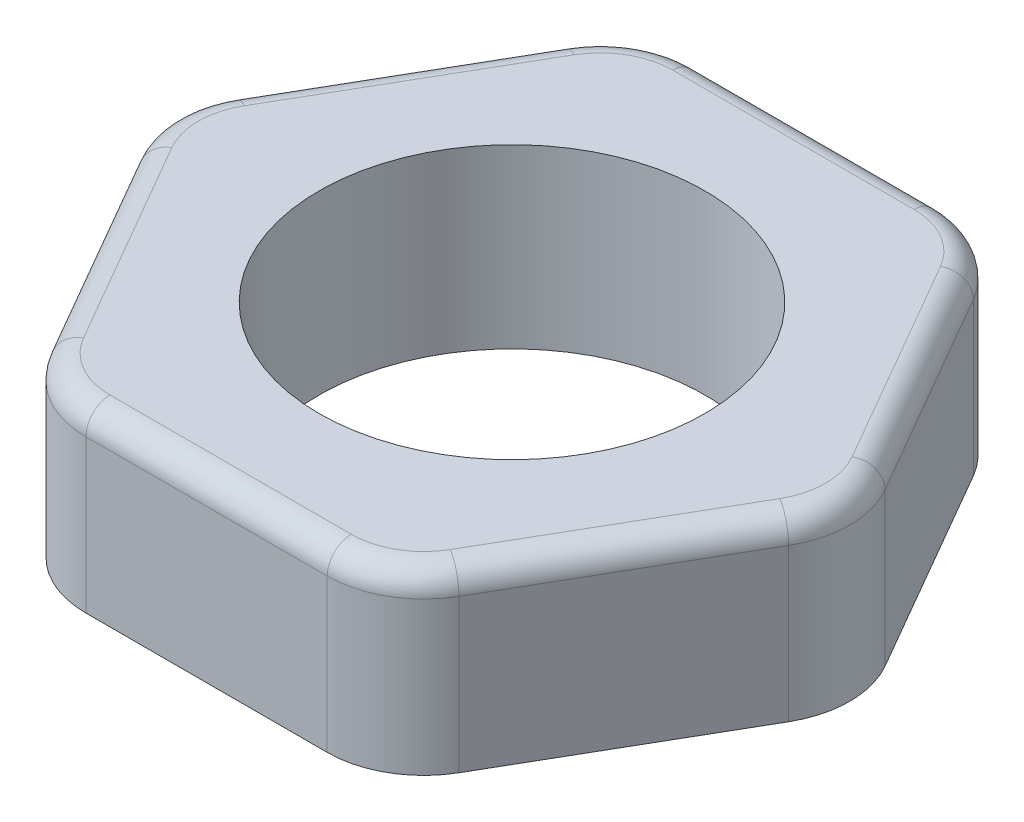
ISO-10303-21;
HEADER;
FILE_DESCRIPTION(('STEP AP214'),'2;1');
FILE_NAME('part.step','',(''),(''),'','','');
FILE_SCHEMA(('AUTOMOTIVE_DESIGN { 1 0 10303 214 1 1 1 1 }'));
ENDSEC;
DATA;
#1=APPLICATION_CONTEXT('core data for automotive mechanical design processes');
#2=APPLICATION_PROTOCOL_DEFINITION('international standard','automotive_design',2000,#1);
#3=PRODUCT_CONTEXT('',#1,'mechanical');
#4=PRODUCT('Part','Part','',(#3));
#5=PRODUCT_RELATED_PRODUCT_CATEGORY('part','',(#4));
#6=PRODUCT_DEFINITION_FORMATION('','',#4);
#7=PRODUCT_DEFINITION_CONTEXT('part definition',#1,'design');
#8=PRODUCT_DEFINITION('design','',#6,#7);
#9=PRODUCT_DEFINITION_SHAPE('','',#8);
#10=(LENGTH_UNIT() NAMED_UNIT(*) SI_UNIT(.MILLI.,.METRE.));
#11=(NAMED_UNIT(*) PLANE_ANGLE_UNIT() SI_UNIT($,.RADIAN.));
#12=(NAMED_UNIT(*) SI_UNIT($,.STERADIAN.) SOLID_ANGLE_UNIT());
#13=UNCERTAINTY_MEASURE_WITH_UNIT(LENGTH_MEASURE(1.E-05),#10,'distance_accuracy_value','');
#14=(GEOMETRIC_REPRESENTATION_CONTEXT(3) GLOBAL_UNCERTAINTY_ASSIGNED_CONTEXT((#13)) GLOBAL_UNIT_ASSIGNED_CONTEXT((#10,
#11,#12)) REPRESENTATION_CONTEXT('',''));
#15=CARTESIAN_POINT('',(0.,0.,0.));
#16=DIRECTION('',(0.,0.,1.));
#17=DIRECTION('',(1.,0.,0.));
#18=AXIS2_PLACEMENT_3D('',#15,#16,#17);
#19=CARTESIAN_POINT('',(0.,5.5,0.));
#20=DIRECTION('',(0.,1.,0.));
#21=DIRECTION('',(0.,0.,1.));
#22=AXIS2_PLACEMENT_3D('',#19,#20,#21);
#23=PLANE('',#22);
#24=CARTESIAN_POINT('',(0.,5.5,0.));
#25=DIRECTION('',(0.,1.,0.));
#26=DIRECTION('',(0.,0.,1.));
#27=AXIS2_PLACEMENT_3D('',#24,#25,#26);
#28=CIRCLE('',#27,6.);
#29=CARTESIAN_POINT('',(0.,5.5,6.));
#30=VERTEX_POINT('',#29);
#31=EDGE_CURVE('E291',#30,#30,#28,.T.);
#32=ORIENTED_EDGE('',*,*,#31,.F.);
#33=EDGE_LOOP('',(#32));
#34=FACE_BOUND('',#33,.T.);
#35=CARTESIAN_POINT('',(3.75277674973264,5.5,6.49999999999992));
#36=DIRECTION('',(0.,1.,0.));
#37=DIRECTION('',(0.,0.,1.));
#38=AXIS2_PLACEMENT_3D('',#35,#36,#37);
#39=CIRCLE('',#38,2.25);
#40=CARTESIAN_POINT('',(5.70133390824763,5.5,7.62499999999991));
#41=VERTEX_POINT('',#40);
#42=CARTESIAN_POINT('',(3.75277674973266,5.5,8.74999999999992));
#43=VERTEX_POINT('',#42);
#44=EDGE_CURVE('E372',#41,#43,#39,.F.);
#45=ORIENTED_EDGE('',*,*,#44,.F.);
#46=DIRECTION('',(0.499999999999995,0.,-0.866025403784442));
#47=VECTOR('',#46,1.);
#48=CARTESIAN_POINT('',(10.3201360617645,5.5,-0.374999999999997));
#49=LINE('',#48,#47);
#50=CARTESIAN_POINT('',(9.4541106579801,5.5,1.125));
#51=VERTEX_POINT('',#50);
#52=EDGE_CURVE('E325',#41,#51,#49,.T.);
#53=ORIENTED_EDGE('',*,*,#52,.T.);
#54=CARTESIAN_POINT('',(7.5055534994651,5.5,0.));
#55=DIRECTION('',(0.,1.,0.));
#56=DIRECTION('',(0.,0.,1.));
#57=AXIS2_PLACEMENT_3D('',#54,#55,#56);
#58=CIRCLE('',#57,2.25);
#59=CARTESIAN_POINT('',(9.45411065798009,5.5,-1.12499999999999));
#60=VERTEX_POINT('',#59);
#61=EDGE_CURVE('E368',#60,#51,#58,.F.);
#62=ORIENTED_EDGE('',*,*,#61,.F.);
#63=DIRECTION('',(-0.500000000000001,0.,-0.866025403784438));
#64=VECTOR('',#63,1.);
#65=CARTESIAN_POINT('',(4.83530850446308,5.5,-9.12499999999998));
#66=LINE('',#65,#64);
#67=CARTESIAN_POINT('',(5.70133390824752,5.5,-7.62499999999998));
#68=VERTEX_POINT('',#67);
#69=EDGE_CURVE('E329',#60,#68,#66,.T.);
#70=ORIENTED_EDGE('',*,*,#69,.T.);
#71=CARTESIAN_POINT('',(3.75277674973253,5.5,-6.49999999999998));
#72=DIRECTION('',(0.,1.,0.));
#73=DIRECTION('',(0.,0.,1.));
#74=AXIS2_PLACEMENT_3D('',#71,#72,#73);
#75=CIRCLE('',#74,2.25);
#76=CARTESIAN_POINT('',(3.75277674973253,5.5,-8.74999999999998));
#77=VERTEX_POINT('',#76);
#78=EDGE_CURVE('E181',#77,#68,#75,.F.);
#79=ORIENTED_EDGE('',*,*,#78,.F.);
#80=DIRECTION('',(-1.,0.,0.));
#81=VECTOR('',#80,1.);
#82=CARTESIAN_POINT('',(-5.48482755730147,5.5,-8.74999999999994));
#83=LINE('',#82,#81);
#84=CARTESIAN_POINT('',(-3.75277674973259,5.5,-8.74999999999995));
#85=VERTEX_POINT('',#84);
#86=EDGE_CURVE('E175',#77,#85,#83,.T.);
#87=ORIENTED_EDGE('',*,*,#86,.T.);
#88=CARTESIAN_POINT('',(-3.75277674973258,5.5,-6.49999999999995));
#89=DIRECTION('',(0.,1.,0.));
#90=DIRECTION('',(0.,0.,1.));
#91=AXIS2_PLACEMENT_3D('',#88,#89,#90);
#92=CIRCLE('',#91,2.25);
#93=CARTESIAN_POINT('',(-5.70133390824757,5.5,-7.62499999999994));
#94=VERTEX_POINT('',#93);
#95=EDGE_CURVE('E170',#94,#85,#92,.F.);
#96=ORIENTED_EDGE('',*,*,#95,.F.);
#97=DIRECTION('',(-0.499999999999995,0.,0.866025403784442));
#98=VECTOR('',#97,1.);
#99=CARTESIAN_POINT('',(-10.3201360617645,5.5,0.375000000000073));
#100=LINE('',#99,#98);
#101=CARTESIAN_POINT('',(-9.45411065798009,5.5,-1.12499999999994));
#102=VERTEX_POINT('',#101);
#103=EDGE_CURVE('E173',#94,#102,#100,.T.);
#104=ORIENTED_EDGE('',*,*,#103,.T.);
#105=CARTESIAN_POINT('',(-7.50555349946509,5.5,0.));
#106=DIRECTION('',(0.,1.,0.));
#107=DIRECTION('',(0.,0.,1.));
#108=AXIS2_PLACEMENT_3D('',#105,#106,#107);
#109=CIRCLE('',#108,2.25);
#110=CARTESIAN_POINT('',(-9.45411065798007,5.5,1.12500000000007));
#111=VERTEX_POINT('',#110);
#112=EDGE_CURVE('E182',#111,#102,#109,.F.);
#113=ORIENTED_EDGE('',*,*,#112,.F.);
#114=DIRECTION('',(0.500000000000007,0.,0.866025403784435));
#115=VECTOR('',#114,1.);
#116=CARTESIAN_POINT('',(-4.83530850446301,5.5,9.12500000000001));
#117=LINE('',#116,#115);
#118=CARTESIAN_POINT('',(-5.70133390824747,5.5,7.62500000000002));
#119=VERTEX_POINT('',#118);
#120=EDGE_CURVE('E193',#111,#119,#117,.T.);
#121=ORIENTED_EDGE('',*,*,#120,.T.);
#122=CARTESIAN_POINT('',(-3.75277674973249,5.5,6.5));
#123=DIRECTION('',(0.,1.,0.));
#124=DIRECTION('',(0.,0.,1.));
#125=AXIS2_PLACEMENT_3D('',#122,#123,#124);
#126=CIRCLE('',#125,2.25);
#127=CARTESIAN_POINT('',(-3.75277674973247,5.5,8.75));
#128=VERTEX_POINT('',#127);
#129=EDGE_CURVE('E360',#128,#119,#126,.F.);
#130=ORIENTED_EDGE('',*,*,#129,.F.);
#131=DIRECTION('',(1.,0.,0.));
#132=VECTOR('',#131,1.);
#133=CARTESIAN_POINT('',(5.48482755730153,5.5,8.7499999999999));
#134=LINE('',#133,#132);
#135=EDGE_CURVE('E321',#128,#43,#134,.T.);
#136=ORIENTED_EDGE('',*,*,#135,.T.);
#137=EDGE_LOOP('',(#45,#53,#62,#70,#79,#87,#96,#104,#113,#121,#130,#136));
#138=FACE_BOUND('',#137,.T.);
#139=ADVANCED_FACE('F41',(#34,#138),#23,.T.);
#140=CARTESIAN_POINT('',(5.48482755730154,5.5,9.4999999999999));
#141=DIRECTION('',(-0.866025403784442,0.,-0.499999999999995));
#142=DIRECTION('',(-0.499999999999995,0.,0.866025403784442));
#143=AXIS2_PLACEMENT_3D('',#140,#141,#142);
#144=PLANE('',#143);
#145=DIRECTION('',(0.499999999999995,0.,-0.866025403784441));
#146=VECTOR('',#145,1.);
#147=CARTESIAN_POINT('',(5.48482755730154,0.,9.4999999999999));
#148=LINE('',#147,#146);
#149=CARTESIAN_POINT('',(6.35085296108596,0.,7.99999999999991));
#150=VERTEX_POINT('',#149);
#151=CARTESIAN_POINT('',(10.1036297108184,0.,1.5));
#152=VERTEX_POINT('',#151);
#153=EDGE_CURVE('E267',#150,#152,#148,.T.);
#154=ORIENTED_EDGE('',*,*,#153,.T.);
#155=DIRECTION('',(0.,-1.,0.));
#156=VECTOR('',#155,1.);
#157=CARTESIAN_POINT('',(10.1036297108184,5.5,1.5));
#158=LINE('',#157,#156);
#159=CARTESIAN_POINT('',(10.1036297108184,4.75,1.5));
#160=VERTEX_POINT('',#159);
#161=EDGE_CURVE('E11',#152,#160,#158,.F.);
#162=ORIENTED_EDGE('',*,*,#161,.T.);
#163=DIRECTION('',(0.499999999999995,0.,-0.866025403784442));
#164=VECTOR('',#163,1.);
#165=CARTESIAN_POINT('',(5.48482755730154,4.75,9.4999999999999));
#166=LINE('',#165,#164);
#167=CARTESIAN_POINT('',(6.35085296108596,4.75,7.99999999999991));
#168=VERTEX_POINT('',#167);
#169=EDGE_CURVE('E352',#160,#168,#166,.F.);
#170=ORIENTED_EDGE('',*,*,#169,.T.);
#171=DIRECTION('',(0.,-1.,0.));
#172=VECTOR('',#171,1.);
#173=CARTESIAN_POINT('',(6.35085296108596,5.5,7.99999999999991));
#174=LINE('',#173,#172);
#175=EDGE_CURVE('E51',#168,#150,#174,.T.);
#176=ORIENTED_EDGE('',*,*,#175,.T.);
#177=EDGE_LOOP('',(#154,#162,#170,#176));
#178=FACE_BOUND('',#177,.T.);
#179=ADVANCED_FACE('F430',(#178),#144,.F.);
#180=CARTESIAN_POINT('',(10.9696551146029,5.5,0.));
#181=DIRECTION('',(-0.866025403784438,0.,0.500000000000001));
#182=DIRECTION('',(0.500000000000001,0.,0.866025403784438));
#183=AXIS2_PLACEMENT_3D('',#180,#181,#182);
#184=PLANE('',#183);
#185=DIRECTION('',(-0.500000000000001,0.,-0.866025403784438));
#186=VECTOR('',#185,1.);
#187=CARTESIAN_POINT('',(10.9696551146029,0.,0.));
#188=LINE('',#187,#186);
#189=CARTESIAN_POINT('',(10.1036297108184,0.,-1.49999999999999));
#190=VERTEX_POINT('',#189);
#191=CARTESIAN_POINT('',(6.35085296108585,0.,-7.99999999999998));
#192=VERTEX_POINT('',#191);
#193=EDGE_CURVE('E302',#190,#192,#188,.T.);
#194=ORIENTED_EDGE('',*,*,#193,.T.);
#195=DIRECTION('',(0.,-1.,0.));
#196=VECTOR('',#195,1.);
#197=CARTESIAN_POINT('',(6.35085296108585,5.5,-7.99999999999998));
#198=LINE('',#197,#196);
#199=CARTESIAN_POINT('',(6.35085296108585,4.75,-7.99999999999998));
#200=VERTEX_POINT('',#199);
#201=EDGE_CURVE('E258',#192,#200,#198,.F.);
#202=ORIENTED_EDGE('',*,*,#201,.T.);
#203=DIRECTION('',(-0.500000000000001,0.,-0.866025403784438));
#204=VECTOR('',#203,1.);
#205=CARTESIAN_POINT('',(10.9696551146029,4.75,0.));
#206=LINE('',#205,#204);
#207=CARTESIAN_POINT('',(10.1036297108184,4.75,-1.49999999999999));
#208=VERTEX_POINT('',#207);
#209=EDGE_CURVE('E349',#200,#208,#206,.F.);
#210=ORIENTED_EDGE('',*,*,#209,.T.);
#211=DIRECTION('',(0.,-1.,0.));
#212=VECTOR('',#211,1.);
#213=CARTESIAN_POINT('',(10.1036297108184,5.5,-1.49999999999999));
#214=LINE('',#213,#212);
#215=EDGE_CURVE('E66',#208,#190,#214,.T.);
#216=ORIENTED_EDGE('',*,*,#215,.T.);
#217=EDGE_LOOP('',(#194,#202,#210,#216));
#218=FACE_BOUND('',#217,.T.);
#219=ADVANCED_FACE('F420',(#218),#184,.F.);
#220=CARTESIAN_POINT('',(5.48482755730141,5.5,-9.49999999999998));
#221=DIRECTION('',(0.,0.,1.));
#222=DIRECTION('',(1.,0.,0.));
#223=AXIS2_PLACEMENT_3D('',#220,#221,#222);
#224=PLANE('',#223);
#225=DIRECTION('',(-1.,0.,0.));
#226=VECTOR('',#225,1.);
#227=CARTESIAN_POINT('',(5.48482755730141,0.,-9.49999999999998));
#228=LINE('',#227,#226);
#229=CARTESIAN_POINT('',(3.75277674973252,0.,-9.49999999999998));
#230=VERTEX_POINT('',#229);
#231=CARTESIAN_POINT('',(-3.75277674973259,0.,-9.49999999999995));
#232=VERTEX_POINT('',#231);
#233=EDGE_CURVE('E305',#230,#232,#228,.T.);
#234=ORIENTED_EDGE('',*,*,#233,.T.);
#235=DIRECTION('',(0.,-1.,0.));
#236=VECTOR('',#235,1.);
#237=CARTESIAN_POINT('',(-3.75277674973259,5.5,-9.49999999999995));
#238=LINE('',#237,#236);
#239=CARTESIAN_POINT('',(-3.75277674973259,4.75,-9.49999999999995));
#240=VERTEX_POINT('',#239);
#241=EDGE_CURVE('E253',#232,#240,#238,.F.);
#242=ORIENTED_EDGE('',*,*,#241,.T.);
#243=DIRECTION('',(-1.,0.,0.));
#244=VECTOR('',#243,1.);
#245=CARTESIAN_POINT('',(5.48482755730141,4.75,-9.49999999999998));
#246=LINE('',#245,#244);
#247=CARTESIAN_POINT('',(3.75277674973252,4.75,-9.49999999999998));
#248=VERTEX_POINT('',#247);
#249=EDGE_CURVE('E345',#240,#248,#246,.F.);
#250=ORIENTED_EDGE('',*,*,#249,.T.);
#251=DIRECTION('',(0.,-1.,0.));
#252=VECTOR('',#251,1.);
#253=CARTESIAN_POINT('',(3.75277674973252,5.5,-9.49999999999998));
#254=LINE('',#253,#252);
#255=EDGE_CURVE('E250',#248,#230,#254,.T.);
#256=ORIENTED_EDGE('',*,*,#255,.T.);
#257=EDGE_LOOP('',(#234,#242,#250,#256));
#258=FACE_BOUND('',#257,.T.);
#259=ADVANCED_FACE('F402',(#258),#224,.F.);
#260=CARTESIAN_POINT('',(-5.48482755730147,5.5,-9.49999999999994));
#261=DIRECTION('',(0.866025403784442,0.,0.499999999999995));
#262=DIRECTION('',(0.499999999999995,0.,-0.866025403784442));
#263=AXIS2_PLACEMENT_3D('',#260,#261,#262);
#264=PLANE('',#263);
#265=DIRECTION('',(-0.499999999999995,0.,0.866025403784442));
#266=VECTOR('',#265,1.);
#267=CARTESIAN_POINT('',(-5.48482755730147,0.,-9.49999999999994));
#268=LINE('',#267,#266);
#269=CARTESIAN_POINT('',(-6.3508529610859,0.,-7.99999999999993));
#270=VERTEX_POINT('',#269);
#271=CARTESIAN_POINT('',(-10.1036297108184,0.,-1.49999999999993));
#272=VERTEX_POINT('',#271);
#273=EDGE_CURVE('E309',#270,#272,#268,.T.);
#274=ORIENTED_EDGE('',*,*,#273,.T.);
#275=DIRECTION('',(0.,-1.,0.));
#276=VECTOR('',#275,1.);
#277=CARTESIAN_POINT('',(-10.1036297108184,5.5,-1.49999999999993));
#278=LINE('',#277,#276);
#279=CARTESIAN_POINT('',(-10.1036297108184,4.75,-1.49999999999993));
#280=VERTEX_POINT('',#279);
#281=EDGE_CURVE('E247',#272,#280,#278,.F.);
#282=ORIENTED_EDGE('',*,*,#281,.T.);
#283=DIRECTION('',(-0.499999999999995,0.,0.866025403784442));
#284=VECTOR('',#283,1.);
#285=CARTESIAN_POINT('',(-5.48482755730147,4.75,-9.49999999999994));
#286=LINE('',#285,#284);
#287=CARTESIAN_POINT('',(-6.3508529610859,4.75,-7.99999999999993));
#288=VERTEX_POINT('',#287);
#289=EDGE_CURVE('E342',#280,#288,#286,.F.);
#290=ORIENTED_EDGE('',*,*,#289,.T.);
#291=DIRECTION('',(0.,-1.,0.));
#292=VECTOR('',#291,1.);
#293=CARTESIAN_POINT('',(-6.3508529610859,5.5,-7.99999999999993));
#294=LINE('',#293,#292);
#295=EDGE_CURVE('E244',#288,#270,#294,.T.);
#296=ORIENTED_EDGE('',*,*,#295,.T.);
#297=EDGE_LOOP('',(#274,#282,#290,#296));
#298=FACE_BOUND('',#297,.T.);
#299=ADVANCED_FACE('F465',(#298),#264,.F.);
#300=CARTESIAN_POINT('',(-10.9696551146029,5.5,0.));
#301=DIRECTION('',(0.866025403784435,0.,-0.500000000000007));
#302=DIRECTION('',(-0.500000000000007,0.,-0.866025403784435));
#303=AXIS2_PLACEMENT_3D('',#300,#301,#302);
#304=PLANE('',#303);
#305=DIRECTION('',(0.500000000000007,0.,0.866025403784435));
#306=VECTOR('',#305,1.);
#307=CARTESIAN_POINT('',(-10.9696551146029,0.,0.));
#308=LINE('',#307,#306);
#309=CARTESIAN_POINT('',(-10.1036297108184,0.,1.50000000000007));
#310=VERTEX_POINT('',#309);
#311=CARTESIAN_POINT('',(-6.35085296108579,0.,8.00000000000002));
#312=VERTEX_POINT('',#311);
#313=EDGE_CURVE('E313',#310,#312,#308,.T.);
#314=ORIENTED_EDGE('',*,*,#313,.T.);
#315=DIRECTION('',(0.,-1.,0.));
#316=VECTOR('',#315,1.);
#317=CARTESIAN_POINT('',(-6.35085296108579,5.5,8.00000000000002));
#318=LINE('',#317,#316);
#319=CARTESIAN_POINT('',(-6.35085296108579,4.75,8.00000000000002));
#320=VERTEX_POINT('',#319);
#321=EDGE_CURVE('E241',#312,#320,#318,.F.);
#322=ORIENTED_EDGE('',*,*,#321,.T.);
#323=DIRECTION('',(0.500000000000007,0.,0.866025403784435));
#324=VECTOR('',#323,1.);
#325=CARTESIAN_POINT('',(-10.9696551146029,4.75,0.));
#326=LINE('',#325,#324);
#327=CARTESIAN_POINT('',(-10.1036297108184,4.75,1.50000000000007));
#328=VERTEX_POINT('',#327);
#329=EDGE_CURVE('E338',#320,#328,#326,.F.);
#330=ORIENTED_EDGE('',*,*,#329,.T.);
#331=DIRECTION('',(0.,-1.,0.));
#332=VECTOR('',#331,1.);
#333=CARTESIAN_POINT('',(-10.1036297108184,5.5,1.50000000000007));
#334=LINE('',#333,#332);
#335=EDGE_CURVE('E238',#328,#310,#334,.T.);
#336=ORIENTED_EDGE('',*,*,#335,.T.);
#337=EDGE_LOOP('',(#314,#322,#330,#336));
#338=FACE_BOUND('',#337,.T.);
#339=ADVANCED_FACE('F456',(#338),#304,.F.);
#340=CARTESIAN_POINT('',(-5.48482755730134,5.5,9.50000000000002));
#341=DIRECTION('',(0.,0.,-1.));
#342=DIRECTION('',(-1.,0.,0.));
#343=AXIS2_PLACEMENT_3D('',#340,#341,#342);
#344=PLANE('',#343);
#345=DIRECTION('',(1.,0.,0.));
#346=VECTOR('',#345,1.);
#347=CARTESIAN_POINT('',(-5.48482755730134,4.75,9.50000000000002));
#348=LINE('',#347,#346);
#349=CARTESIAN_POINT('',(3.75277674973267,4.75,9.49999999999992));
#350=VERTEX_POINT('',#349);
#351=CARTESIAN_POINT('',(-3.75277674973246,4.75,9.5));
#352=VERTEX_POINT('',#351);
#353=EDGE_CURVE('E356',#350,#352,#348,.F.);
#354=ORIENTED_EDGE('',*,*,#353,.T.);
#355=DIRECTION('',(0.,-1.,0.));
#356=VECTOR('',#355,1.);
#357=CARTESIAN_POINT('',(-3.75277674973246,5.5,9.5));
#358=LINE('',#357,#356);
#359=CARTESIAN_POINT('',(-3.75277674973246,0.,9.5));
#360=VERTEX_POINT('',#359);
#361=EDGE_CURVE('E218',#352,#360,#358,.T.);
#362=ORIENTED_EDGE('',*,*,#361,.T.);
#363=DIRECTION('',(1.,0.,0.));
#364=VECTOR('',#363,1.);
#365=CARTESIAN_POINT('',(-5.48482755730134,0.,9.50000000000002));
#366=LINE('',#365,#364);
#367=CARTESIAN_POINT('',(3.75277674973267,0.,9.49999999999992));
#368=VERTEX_POINT('',#367);
#369=EDGE_CURVE('E317',#360,#368,#366,.T.);
#370=ORIENTED_EDGE('',*,*,#369,.T.);
#371=DIRECTION('',(0.,-1.,0.));
#372=VECTOR('',#371,1.);
#373=CARTESIAN_POINT('',(3.75277674973267,5.5,9.49999999999992));
#374=LINE('',#373,#372);
#375=EDGE_CURVE('E215',#368,#350,#374,.F.);
#376=ORIENTED_EDGE('',*,*,#375,.T.);
#377=EDGE_LOOP('',(#354,#362,#370,#376));
#378=FACE_BOUND('',#377,.T.);
#379=ADVANCED_FACE('F449',(#378),#344,.F.);
#380=CARTESIAN_POINT('',(0.,0.,0.));
#381=DIRECTION('',(0.,1.,0.));
#382=DIRECTION('',(0.,0.,1.));
#383=AXIS2_PLACEMENT_3D('',#380,#381,#382);
#384=PLANE('',#383);
#385=CARTESIAN_POINT('',(0.,0.,0.));
#386=DIRECTION('',(0.,1.,0.));
#387=DIRECTION('',(0.,0.,1.));
#388=AXIS2_PLACEMENT_3D('',#385,#386,#387);
#389=CIRCLE('',#388,6.);
#390=CARTESIAN_POINT('',(0.,0.,6.));
#391=VERTEX_POINT('',#390);
#392=EDGE_CURVE('E285',#391,#391,#389,.T.);
#393=ORIENTED_EDGE('',*,*,#392,.T.);
#394=EDGE_LOOP('',(#393));
#395=FACE_BOUND('',#394,.T.);
#396=ORIENTED_EDGE('',*,*,#369,.F.);
#397=CARTESIAN_POINT('',(-3.75277674973249,0.,6.5));
#398=DIRECTION('',(0.,1.,0.));
#399=DIRECTION('',(0.,0.,1.));
#400=AXIS2_PLACEMENT_3D('',#397,#398,#399);
#401=CIRCLE('',#400,3.);
#402=EDGE_CURVE('E235',#360,#312,#401,.F.);
#403=ORIENTED_EDGE('',*,*,#402,.T.);
#404=ORIENTED_EDGE('',*,*,#313,.F.);
#405=CARTESIAN_POINT('',(-7.50555349946509,0.,0.));
#406=DIRECTION('',(0.,1.,0.));
#407=DIRECTION('',(0.,0.,1.));
#408=AXIS2_PLACEMENT_3D('',#405,#406,#407);
#409=CIRCLE('',#408,3.);
#410=EDGE_CURVE('E232',#310,#272,#409,.F.);
#411=ORIENTED_EDGE('',*,*,#410,.T.);
#412=ORIENTED_EDGE('',*,*,#273,.F.);
#413=CARTESIAN_POINT('',(-3.75277674973258,0.,-6.49999999999995));
#414=DIRECTION('',(0.,1.,0.));
#415=DIRECTION('',(0.,0.,1.));
#416=AXIS2_PLACEMENT_3D('',#413,#414,#415);
#417=CIRCLE('',#416,3.);
#418=EDGE_CURVE('E229',#270,#232,#417,.F.);
#419=ORIENTED_EDGE('',*,*,#418,.T.);
#420=ORIENTED_EDGE('',*,*,#233,.F.);
#421=CARTESIAN_POINT('',(3.75277674973253,0.,-6.49999999999998));
#422=DIRECTION('',(0.,1.,0.));
#423=DIRECTION('',(0.,0.,1.));
#424=AXIS2_PLACEMENT_3D('',#421,#422,#423);
#425=CIRCLE('',#424,3.);
#426=EDGE_CURVE('E59',#230,#192,#425,.F.);
#427=ORIENTED_EDGE('',*,*,#426,.T.);
#428=ORIENTED_EDGE('',*,*,#193,.F.);
#429=CARTESIAN_POINT('',(7.5055534994651,0.,0.));
#430=DIRECTION('',(0.,1.,0.));
#431=DIRECTION('',(0.,0.,1.));
#432=AXIS2_PLACEMENT_3D('',#429,#430,#431);
#433=CIRCLE('',#432,3.);
#434=EDGE_CURVE('E224',#190,#152,#433,.F.);
#435=ORIENTED_EDGE('',*,*,#434,.T.);
#436=ORIENTED_EDGE('',*,*,#153,.F.);
#437=CARTESIAN_POINT('',(3.75277674973264,0.,6.49999999999992));
#438=DIRECTION('',(0.,1.,0.));
#439=DIRECTION('',(0.,0.,1.));
#440=AXIS2_PLACEMENT_3D('',#437,#438,#439);
#441=CIRCLE('',#440,3.);
#442=EDGE_CURVE('E221',#150,#368,#441,.F.);
#443=ORIENTED_EDGE('',*,*,#442,.T.);
#444=EDGE_LOOP('',(#396,#403,#404,#411,#412,#419,#420,#427,#428,#435,#436,#443));
#445=FACE_BOUND('',#444,.T.);
#446=ADVANCED_FACE('F427',(#395,#445),#384,.F.);
#447=CARTESIAN_POINT('',(7.5777222831138,4.75,-4.37499999999999));
#448=DIRECTION('',(0.500000000000001,0.,0.866025403784438));
#449=DIRECTION('',(0.866025403784438,0.,-0.500000000000001));
#450=AXIS2_PLACEMENT_3D('',#447,#448,#449);
#451=CYLINDRICAL_SURFACE('',#450,0.75);
#452=ORIENTED_EDGE('',*,*,#209,.F.);
#453=CARTESIAN_POINT('',(5.70133390824752,4.75,-7.62499999999998));
#454=DIRECTION('',(0.500000000000001,0.,0.866025403784438));
#455=DIRECTION('',(0.866025403784438,0.,-0.500000000000001));
#456=AXIS2_PLACEMENT_3D('',#453,#454,#455);
#457=CIRCLE('',#456,0.75);
#458=EDGE_CURVE('E391',#200,#68,#457,.T.);
#459=ORIENTED_EDGE('',*,*,#458,.T.);
#460=ORIENTED_EDGE('',*,*,#69,.F.);
#461=CARTESIAN_POINT('',(9.45411065798009,4.75,-1.12499999999999));
#462=DIRECTION('',(-0.500000000000001,0.,-0.866025403784438));
#463=DIRECTION('',(-0.866025403784438,0.,0.500000000000001));
#464=AXIS2_PLACEMENT_3D('',#461,#462,#463);
#465=CIRCLE('',#464,0.75);
#466=EDGE_CURVE('E388',#60,#208,#465,.T.);
#467=ORIENTED_EDGE('',*,*,#466,.T.);
#468=EDGE_LOOP('',(#452,#459,#460,#467));
#469=FACE_BOUND('',#468,.T.);
#470=ADVANCED_FACE('F413',(#469),#451,.T.);
#471=CARTESIAN_POINT('',(0.,4.75,-8.74999999999996));
#472=DIRECTION('',(1.,0.,0.));
#473=DIRECTION('',(0.,0.,-1.));
#474=AXIS2_PLACEMENT_3D('',#471,#472,#473);
#475=CYLINDRICAL_SURFACE('',#474,0.75);
#476=ORIENTED_EDGE('',*,*,#249,.F.);
#477=CARTESIAN_POINT('',(-3.75277674973259,4.75,-8.74999999999995));
#478=DIRECTION('',(1.,0.,0.));
#479=DIRECTION('',(0.,0.,-1.));
#480=AXIS2_PLACEMENT_3D('',#477,#478,#479);
#481=CIRCLE('',#480,0.75);
#482=EDGE_CURVE('E200',#240,#85,#481,.T.);
#483=ORIENTED_EDGE('',*,*,#482,.T.);
#484=ORIENTED_EDGE('',*,*,#86,.F.);
#485=CARTESIAN_POINT('',(3.75277674973253,4.75,-8.74999999999998));
#486=DIRECTION('',(-1.,0.,0.));
#487=DIRECTION('',(0.,0.,1.));
#488=AXIS2_PLACEMENT_3D('',#485,#486,#487);
#489=CIRCLE('',#488,0.75);
#490=EDGE_CURVE('E206',#77,#248,#489,.T.);
#491=ORIENTED_EDGE('',*,*,#490,.T.);
#492=EDGE_LOOP('',(#476,#483,#484,#491));
#493=FACE_BOUND('',#492,.T.);
#494=ADVANCED_FACE('F398',(#493),#475,.T.);
#495=CARTESIAN_POINT('',(7.57772228311386,4.75,4.37499999999996));
#496=DIRECTION('',(-0.499999999999995,0.,0.866025403784442));
#497=DIRECTION('',(0.866025403784442,0.,0.499999999999995));
#498=AXIS2_PLACEMENT_3D('',#495,#496,#497);
#499=CYLINDRICAL_SURFACE('',#498,0.75);
#500=ORIENTED_EDGE('',*,*,#169,.F.);
#501=CARTESIAN_POINT('',(9.4541106579801,4.75,1.125));
#502=DIRECTION('',(-0.499999999999994,0.,0.866025403784442));
#503=DIRECTION('',(0.866025403784442,0.,0.499999999999995));
#504=AXIS2_PLACEMENT_3D('',#501,#502,#503);
#505=CIRCLE('',#504,0.75);
#506=EDGE_CURVE('E385',#160,#51,#505,.T.);
#507=ORIENTED_EDGE('',*,*,#506,.T.);
#508=ORIENTED_EDGE('',*,*,#52,.F.);
#509=CARTESIAN_POINT('',(5.70133390824763,4.75,7.62499999999991));
#510=DIRECTION('',(0.499999999999995,0.,-0.866025403784442));
#511=DIRECTION('',(-0.866025403784442,0.,-0.499999999999995));
#512=AXIS2_PLACEMENT_3D('',#509,#510,#511);
#513=CIRCLE('',#512,0.75);
#514=EDGE_CURVE('E382',#41,#168,#513,.T.);
#515=ORIENTED_EDGE('',*,*,#514,.T.);
#516=EDGE_LOOP('',(#500,#507,#508,#515));
#517=FACE_BOUND('',#516,.T.);
#518=ADVANCED_FACE('F509',(#517),#499,.T.);
#519=CARTESIAN_POINT('',(-7.57772228311383,4.75,-4.37499999999994));
#520=DIRECTION('',(0.499999999999995,0.,-0.866025403784442));
#521=DIRECTION('',(-0.866025403784442,0.,-0.499999999999995));
#522=AXIS2_PLACEMENT_3D('',#519,#520,#521);
#523=CYLINDRICAL_SURFACE('',#522,0.75);
#524=ORIENTED_EDGE('',*,*,#289,.F.);
#525=CARTESIAN_POINT('',(-9.45411065798009,4.75,-1.12499999999994));
#526=DIRECTION('',(0.499999999999995,0.,-0.866025403784441));
#527=DIRECTION('',(-0.866025403784441,0.,-0.499999999999995));
#528=AXIS2_PLACEMENT_3D('',#525,#526,#527);
#529=CIRCLE('',#528,0.75);
#530=EDGE_CURVE('E191',#280,#102,#529,.T.);
#531=ORIENTED_EDGE('',*,*,#530,.T.);
#532=ORIENTED_EDGE('',*,*,#103,.F.);
#533=CARTESIAN_POINT('',(-5.70133390824757,4.75,-7.62499999999994));
#534=DIRECTION('',(-0.499999999999995,0.,0.866025403784442));
#535=DIRECTION('',(0.866025403784442,0.,0.499999999999995));
#536=AXIS2_PLACEMENT_3D('',#533,#534,#535);
#537=CIRCLE('',#536,0.75);
#538=EDGE_CURVE('E188',#94,#288,#537,.T.);
#539=ORIENTED_EDGE('',*,*,#538,.T.);
#540=EDGE_LOOP('',(#524,#531,#532,#539));
#541=FACE_BOUND('',#540,.T.);
#542=ADVANCED_FACE('F187',(#541),#523,.T.);
#543=CARTESIAN_POINT('',(0.,4.75,8.74999999999996));
#544=DIRECTION('',(-1.,0.,0.));
#545=DIRECTION('',(0.,0.,1.));
#546=AXIS2_PLACEMENT_3D('',#543,#544,#545);
#547=CYLINDRICAL_SURFACE('',#546,0.75);
#548=ORIENTED_EDGE('',*,*,#353,.F.);
#549=CARTESIAN_POINT('',(3.75277674973266,4.75,8.74999999999992));
#550=DIRECTION('',(-1.,0.,0.));
#551=DIRECTION('',(0.,0.,1.));
#552=AXIS2_PLACEMENT_3D('',#549,#550,#551);
#553=CIRCLE('',#552,0.75);
#554=EDGE_CURVE('E379',#350,#43,#553,.T.);
#555=ORIENTED_EDGE('',*,*,#554,.T.);
#556=ORIENTED_EDGE('',*,*,#135,.F.);
#557=CARTESIAN_POINT('',(-3.75277674973247,4.75,8.75));
#558=DIRECTION('',(1.,0.,0.));
#559=DIRECTION('',(0.,0.,-1.));
#560=AXIS2_PLACEMENT_3D('',#557,#558,#559);
#561=CIRCLE('',#560,0.75);
#562=EDGE_CURVE('E376',#128,#352,#561,.T.);
#563=ORIENTED_EDGE('',*,*,#562,.T.);
#564=EDGE_LOOP('',(#548,#555,#556,#563));
#565=FACE_BOUND('',#564,.T.);
#566=ADVANCED_FACE('F443',(#565),#547,.T.);
#567=CARTESIAN_POINT('',(-7.57772228311377,4.75,4.37500000000004));
#568=DIRECTION('',(-0.500000000000007,0.,-0.866025403784435));
#569=DIRECTION('',(-0.866025403784435,0.,0.500000000000007));
#570=AXIS2_PLACEMENT_3D('',#567,#568,#569);
#571=CYLINDRICAL_SURFACE('',#570,0.75);
#572=ORIENTED_EDGE('',*,*,#329,.F.);
#573=CARTESIAN_POINT('',(-5.70133390824747,4.75,7.62500000000002));
#574=DIRECTION('',(-0.500000000000007,0.,-0.866025403784434));
#575=DIRECTION('',(-0.866025403784435,0.,0.500000000000007));
#576=AXIS2_PLACEMENT_3D('',#573,#574,#575);
#577=CIRCLE('',#576,0.75);
#578=EDGE_CURVE('E212',#320,#119,#577,.T.);
#579=ORIENTED_EDGE('',*,*,#578,.T.);
#580=ORIENTED_EDGE('',*,*,#120,.F.);
#581=CARTESIAN_POINT('',(-9.45411065798007,4.75,1.12500000000007));
#582=DIRECTION('',(0.500000000000007,0.,0.866025403784434));
#583=DIRECTION('',(0.866025403784435,0.,-0.500000000000007));
#584=AXIS2_PLACEMENT_3D('',#581,#582,#583);
#585=CIRCLE('',#584,0.75);
#586=EDGE_CURVE('E204',#111,#328,#585,.T.);
#587=ORIENTED_EDGE('',*,*,#586,.T.);
#588=EDGE_LOOP('',(#572,#579,#580,#587));
#589=FACE_BOUND('',#588,.T.);
#590=ADVANCED_FACE('F501',(#589),#571,.T.);
#591=CARTESIAN_POINT('',(3.75277674973264,5.5,6.49999999999992));
#592=DIRECTION('',(0.,-1.,0.));
#593=DIRECTION('',(0.,0.,-1.));
#594=AXIS2_PLACEMENT_3D('',#591,#592,#593);
#595=CYLINDRICAL_SURFACE('',#594,3.);
#596=ORIENTED_EDGE('',*,*,#442,.F.);
#597=ORIENTED_EDGE('',*,*,#175,.F.);
#598=CARTESIAN_POINT('',(3.75277674973264,4.75,6.49999999999992));
#599=DIRECTION('',(0.,1.,0.));
#600=DIRECTION('',(0.,0.,1.));
#601=AXIS2_PLACEMENT_3D('',#598,#599,#600);
#602=CIRCLE('',#601,3.);
#603=EDGE_CURVE('E263',#350,#168,#602,.T.);
#604=ORIENTED_EDGE('',*,*,#603,.F.);
#605=ORIENTED_EDGE('',*,*,#375,.F.);
#606=EDGE_LOOP('',(#596,#597,#604,#605));
#607=FACE_BOUND('',#606,.T.);
#608=ADVANCED_FACE('F435',(#607),#595,.T.);
#609=CARTESIAN_POINT('',(3.75277674973264,4.75,6.49999999999992));
#610=DIRECTION('',(0.,1.,0.));
#611=DIRECTION('',(0.,0.,1.));
#612=AXIS2_PLACEMENT_3D('',#609,#610,#611);
#613=TOROIDAL_SURFACE('',#612,2.25,0.75);
#614=ORIENTED_EDGE('',*,*,#514,.F.);
#615=ORIENTED_EDGE('',*,*,#44,.T.);
#616=ORIENTED_EDGE('',*,*,#554,.F.);
#617=ORIENTED_EDGE('',*,*,#603,.T.);
#618=EDGE_LOOP('',(#614,#615,#616,#617));
#619=FACE_BOUND('',#618,.T.);
#620=ADVANCED_FACE('F439',(#619),#613,.T.);
#621=CARTESIAN_POINT('',(7.5055534994651,5.5,0.));
#622=DIRECTION('',(0.,-1.,0.));
#623=DIRECTION('',(0.,0.,-1.));
#624=AXIS2_PLACEMENT_3D('',#621,#622,#623);
#625=CYLINDRICAL_SURFACE('',#624,3.);
#626=ORIENTED_EDGE('',*,*,#434,.F.);
#627=ORIENTED_EDGE('',*,*,#215,.F.);
#628=CARTESIAN_POINT('',(7.5055534994651,4.75,0.));
#629=DIRECTION('',(0.,1.,0.));
#630=DIRECTION('',(0.,0.,1.));
#631=AXIS2_PLACEMENT_3D('',#628,#629,#630);
#632=CIRCLE('',#631,3.);
#633=EDGE_CURVE('E268',#160,#208,#632,.T.);
#634=ORIENTED_EDGE('',*,*,#633,.F.);
#635=ORIENTED_EDGE('',*,*,#161,.F.);
#636=EDGE_LOOP('',(#626,#627,#634,#635));
#637=FACE_BOUND('',#636,.T.);
#638=ADVANCED_FACE('F423',(#637),#625,.T.);
#639=CARTESIAN_POINT('',(7.5055534994651,4.75,0.));
#640=DIRECTION('',(0.,1.,0.));
#641=DIRECTION('',(0.,0.,1.));
#642=AXIS2_PLACEMENT_3D('',#639,#640,#641);
#643=TOROIDAL_SURFACE('',#642,2.25,0.75);
#644=ORIENTED_EDGE('',*,*,#466,.F.);
#645=ORIENTED_EDGE('',*,*,#61,.T.);
#646=ORIENTED_EDGE('',*,*,#506,.F.);
#647=ORIENTED_EDGE('',*,*,#633,.T.);
#648=EDGE_LOOP('',(#644,#645,#646,#647));
#649=FACE_BOUND('',#648,.T.);
#650=ADVANCED_FACE('F418',(#649),#643,.T.);
#651=CARTESIAN_POINT('',(3.75277674973253,5.5,-6.49999999999998));
#652=DIRECTION('',(0.,-1.,0.));
#653=DIRECTION('',(0.,0.,-1.));
#654=AXIS2_PLACEMENT_3D('',#651,#652,#653);
#655=CYLINDRICAL_SURFACE('',#654,3.);
#656=ORIENTED_EDGE('',*,*,#426,.F.);
#657=ORIENTED_EDGE('',*,*,#255,.F.);
#658=CARTESIAN_POINT('',(3.75277674973253,4.75,-6.49999999999998));
#659=DIRECTION('',(0.,1.,0.));
#660=DIRECTION('',(0.,0.,1.));
#661=AXIS2_PLACEMENT_3D('',#658,#659,#660);
#662=CIRCLE('',#661,3.);
#663=EDGE_CURVE('E272',#200,#248,#662,.T.);
#664=ORIENTED_EDGE('',*,*,#663,.F.);
#665=ORIENTED_EDGE('',*,*,#201,.F.);
#666=EDGE_LOOP('',(#656,#657,#664,#665));
#667=FACE_BOUND('',#666,.T.);
#668=ADVANCED_FACE('F406',(#667),#655,.T.);
#669=CARTESIAN_POINT('',(3.75277674973253,4.75,-6.49999999999998));
#670=DIRECTION('',(0.,1.,0.));
#671=DIRECTION('',(0.,0.,1.));
#672=AXIS2_PLACEMENT_3D('',#669,#670,#671);
#673=TOROIDAL_SURFACE('',#672,2.25,0.75);
#674=ORIENTED_EDGE('',*,*,#458,.F.);
#675=ORIENTED_EDGE('',*,*,#663,.T.);
#676=ORIENTED_EDGE('',*,*,#490,.F.);
#677=ORIENTED_EDGE('',*,*,#78,.T.);
#678=EDGE_LOOP('',(#674,#675,#676,#677));
#679=FACE_BOUND('',#678,.T.);
#680=ADVANCED_FACE('F409',(#679),#673,.T.);
#681=CARTESIAN_POINT('',(-3.75277674973258,5.5,-6.49999999999995));
#682=DIRECTION('',(0.,-1.,0.));
#683=DIRECTION('',(0.,0.,-1.));
#684=AXIS2_PLACEMENT_3D('',#681,#682,#683);
#685=CYLINDRICAL_SURFACE('',#684,3.);
#686=ORIENTED_EDGE('',*,*,#418,.F.);
#687=ORIENTED_EDGE('',*,*,#295,.F.);
#688=CARTESIAN_POINT('',(-3.75277674973258,4.75,-6.49999999999995));
#689=DIRECTION('',(0.,1.,0.));
#690=DIRECTION('',(0.,0.,1.));
#691=AXIS2_PLACEMENT_3D('',#688,#689,#690);
#692=CIRCLE('',#691,3.);
#693=EDGE_CURVE('E198',#240,#288,#692,.T.);
#694=ORIENTED_EDGE('',*,*,#693,.F.);
#695=ORIENTED_EDGE('',*,*,#241,.F.);
#696=EDGE_LOOP('',(#686,#687,#694,#695));
#697=FACE_BOUND('',#696,.T.);
#698=ADVANCED_FACE('F468',(#697),#685,.T.);
#699=CARTESIAN_POINT('',(-3.75277674973258,4.75,-6.49999999999995));
#700=DIRECTION('',(0.,1.,0.));
#701=DIRECTION('',(0.,0.,1.));
#702=AXIS2_PLACEMENT_3D('',#699,#700,#701);
#703=TOROIDAL_SURFACE('',#702,2.25,0.75);
#704=ORIENTED_EDGE('',*,*,#482,.F.);
#705=ORIENTED_EDGE('',*,*,#693,.T.);
#706=ORIENTED_EDGE('',*,*,#538,.F.);
#707=ORIENTED_EDGE('',*,*,#95,.T.);
#708=EDGE_LOOP('',(#704,#705,#706,#707));
#709=FACE_BOUND('',#708,.T.);
#710=ADVANCED_FACE('F196',(#709),#703,.T.);
#711=CARTESIAN_POINT('',(-7.50555349946509,5.5,0.));
#712=DIRECTION('',(0.,-1.,0.));
#713=DIRECTION('',(0.,0.,-1.));
#714=AXIS2_PLACEMENT_3D('',#711,#712,#713);
#715=CYLINDRICAL_SURFACE('',#714,3.);
#716=ORIENTED_EDGE('',*,*,#410,.F.);
#717=ORIENTED_EDGE('',*,*,#335,.F.);
#718=CARTESIAN_POINT('',(-7.50555349946509,4.75,0.));
#719=DIRECTION('',(0.,1.,0.));
#720=DIRECTION('',(0.,0.,1.));
#721=AXIS2_PLACEMENT_3D('',#718,#719,#720);
#722=CIRCLE('',#721,3.);
#723=EDGE_CURVE('E277',#280,#328,#722,.T.);
#724=ORIENTED_EDGE('',*,*,#723,.F.);
#725=ORIENTED_EDGE('',*,*,#281,.F.);
#726=EDGE_LOOP('',(#716,#717,#724,#725));
#727=FACE_BOUND('',#726,.T.);
#728=ADVANCED_FACE('F460',(#727),#715,.T.);
#729=CARTESIAN_POINT('',(-7.50555349946509,4.75,0.));
#730=DIRECTION('',(0.,1.,0.));
#731=DIRECTION('',(0.,0.,1.));
#732=AXIS2_PLACEMENT_3D('',#729,#730,#731);
#733=TOROIDAL_SURFACE('',#732,2.25,0.75);
#734=ORIENTED_EDGE('',*,*,#530,.F.);
#735=ORIENTED_EDGE('',*,*,#723,.T.);
#736=ORIENTED_EDGE('',*,*,#586,.F.);
#737=ORIENTED_EDGE('',*,*,#112,.T.);
#738=EDGE_LOOP('',(#734,#735,#736,#737));
#739=FACE_BOUND('',#738,.T.);
#740=ADVANCED_FACE('F555',(#739),#733,.T.);
#741=CARTESIAN_POINT('',(-3.75277674973249,5.5,6.5));
#742=DIRECTION('',(0.,-1.,0.));
#743=DIRECTION('',(0.,0.,-1.));
#744=AXIS2_PLACEMENT_3D('',#741,#742,#743);
#745=CYLINDRICAL_SURFACE('',#744,3.);
#746=ORIENTED_EDGE('',*,*,#402,.F.);
#747=ORIENTED_EDGE('',*,*,#361,.F.);
#748=CARTESIAN_POINT('',(-3.75277674973249,4.75,6.5));
#749=DIRECTION('',(0.,1.,0.));
#750=DIRECTION('',(0.,0.,1.));
#751=AXIS2_PLACEMENT_3D('',#748,#749,#750);
#752=CIRCLE('',#751,3.);
#753=EDGE_CURVE('E45',#320,#352,#752,.T.);
#754=ORIENTED_EDGE('',*,*,#753,.F.);
#755=ORIENTED_EDGE('',*,*,#321,.F.);
#756=EDGE_LOOP('',(#746,#747,#754,#755));
#757=FACE_BOUND('',#756,.T.);
#758=ADVANCED_FACE('F43',(#757),#745,.T.);
#759=CARTESIAN_POINT('',(-3.75277674973249,4.75,6.5));
#760=DIRECTION('',(0.,1.,0.));
#761=DIRECTION('',(0.,0.,1.));
#762=AXIS2_PLACEMENT_3D('',#759,#760,#761);
#763=TOROIDAL_SURFACE('',#762,2.25,0.75);
#764=ORIENTED_EDGE('',*,*,#562,.F.);
#765=ORIENTED_EDGE('',*,*,#129,.T.);
#766=ORIENTED_EDGE('',*,*,#578,.F.);
#767=ORIENTED_EDGE('',*,*,#753,.T.);
#768=EDGE_LOOP('',(#764,#765,#766,#767));
#769=FACE_BOUND('',#768,.T.);
#770=ADVANCED_FACE('F446',(#769),#763,.T.);
#771=CARTESIAN_POINT('',(0.,0.,0.));
#772=DIRECTION('',(0.,1.,0.));
#773=DIRECTION('',(0.,0.,1.));
#774=AXIS2_PLACEMENT_3D('',#771,#772,#773);
#775=CYLINDRICAL_SURFACE('',#774,6.);
#776=ORIENTED_EDGE('',*,*,#392,.F.);
#777=EDGE_LOOP('',(#776));
#778=FACE_BOUND('',#777,.T.);
#779=ORIENTED_EDGE('',*,*,#31,.T.);
#780=EDGE_LOOP('',(#779));
#781=FACE_BOUND('',#780,.T.);
#782=ADVANCED_FACE('F488',(#778,#781),#775,.F.);
#783=CLOSED_SHELL('',(#139,#179,#219,#259,#299,#339,#379,#446,#470,#494,#518,#542,#566,#590,
#608,#620,#638,#650,#668,#680,#698,#710,#728,#740,#758,#770,#782));
#784=MANIFOLD_SOLID_BREP('B2',#783);
#785=ADVANCED_BREP_SHAPE_REPRESENTATION('',(#18,#784),#14);
#786=SHAPE_DEFINITION_REPRESENTATION(#9,#785);
ENDSEC;
END-ISO-10303-21;
